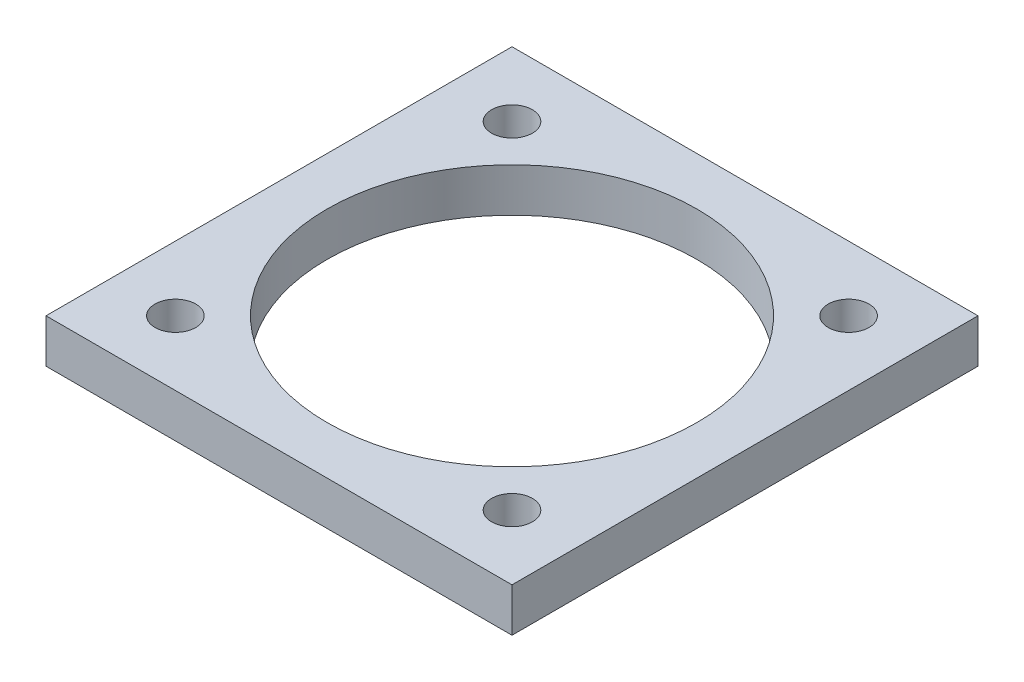
ISO-10303-21;
HEADER;
FILE_DESCRIPTION(('STEP AP214'),'2;1');
FILE_NAME('part.step','',(''),(''),'','','');
FILE_SCHEMA(('AUTOMOTIVE_DESIGN { 1 0 10303 214 1 1 1 1 }'));
ENDSEC;
DATA;
#1=APPLICATION_CONTEXT('core data for automotive mechanical design processes');
#2=APPLICATION_PROTOCOL_DEFINITION('international standard','automotive_design',2000,#1);
#3=PRODUCT_CONTEXT('',#1,'mechanical');
#4=PRODUCT('Part','Part','',(#3));
#5=PRODUCT_RELATED_PRODUCT_CATEGORY('part','',(#4));
#6=PRODUCT_DEFINITION_FORMATION('','',#4);
#7=PRODUCT_DEFINITION_CONTEXT('part definition',#1,'design');
#8=PRODUCT_DEFINITION('design','',#6,#7);
#9=PRODUCT_DEFINITION_SHAPE('','',#8);
#10=(LENGTH_UNIT() NAMED_UNIT(*) SI_UNIT(.MILLI.,.METRE.));
#11=(NAMED_UNIT(*) PLANE_ANGLE_UNIT() SI_UNIT($,.RADIAN.));
#12=(NAMED_UNIT(*) SI_UNIT($,.STERADIAN.) SOLID_ANGLE_UNIT());
#13=UNCERTAINTY_MEASURE_WITH_UNIT(LENGTH_MEASURE(1.E-05),#10,'distance_accuracy_value','');
#14=(GEOMETRIC_REPRESENTATION_CONTEXT(3) GLOBAL_UNCERTAINTY_ASSIGNED_CONTEXT((#13)) GLOBAL_UNIT_ASSIGNED_CONTEXT((#10,
#11,#12)) REPRESENTATION_CONTEXT('',''));
#15=CARTESIAN_POINT('',(0.,0.,0.));
#16=DIRECTION('',(0.,0.,1.));
#17=DIRECTION('',(1.,0.,0.));
#18=AXIS2_PLACEMENT_3D('',#15,#16,#17);
#19=CARTESIAN_POINT('',(0.,3.,0.));
#20=DIRECTION('',(0.,1.,0.));
#21=DIRECTION('',(0.,0.,1.));
#22=AXIS2_PLACEMENT_3D('',#19,#20,#21);
#23=PLANE('',#22);
#24=CARTESIAN_POINT('',(-11.557,3.,-11.557));
#25=DIRECTION('',(0.,1.,0.));
#26=DIRECTION('',(0.,0.,1.));
#27=AXIS2_PLACEMENT_3D('',#24,#25,#26);
#28=CIRCLE('',#27,1.4);
#29=CARTESIAN_POINT('',(-11.557,3.,-10.157));
#30=VERTEX_POINT('',#29);
#31=EDGE_CURVE('E156',#30,#30,#28,.T.);
#32=ORIENTED_EDGE('',*,*,#31,.F.);
#33=EDGE_LOOP('',(#32));
#34=FACE_BOUND('',#33,.T.);
#35=CARTESIAN_POINT('',(11.557,3.,11.557));
#36=DIRECTION('',(0.,1.,0.));
#37=DIRECTION('',(0.,0.,1.));
#38=AXIS2_PLACEMENT_3D('',#35,#36,#37);
#39=CIRCLE('',#38,1.4);
#40=CARTESIAN_POINT('',(11.557,3.,12.957));
#41=VERTEX_POINT('',#40);
#42=EDGE_CURVE('E140',#41,#41,#39,.T.);
#43=ORIENTED_EDGE('',*,*,#42,.F.);
#44=EDGE_LOOP('',(#43));
#45=FACE_BOUND('',#44,.T.);
#46=DIRECTION('',(0.,0.,1.));
#47=VECTOR('',#46,1.);
#48=CARTESIAN_POINT('',(-16.,3.,16.));
#49=LINE('',#48,#47);
#50=CARTESIAN_POINT('',(-16.,3.,-16.));
#51=VERTEX_POINT('',#50);
#52=CARTESIAN_POINT('',(-16.,3.,16.));
#53=VERTEX_POINT('',#52);
#54=EDGE_CURVE('E98',#51,#53,#49,.T.);
#55=ORIENTED_EDGE('',*,*,#54,.T.);
#56=DIRECTION('',(1.,0.,0.));
#57=VECTOR('',#56,1.);
#58=CARTESIAN_POINT('',(16.,3.,16.));
#59=LINE('',#58,#57);
#60=CARTESIAN_POINT('',(16.,3.,16.));
#61=VERTEX_POINT('',#60);
#62=EDGE_CURVE('E93',#53,#61,#59,.T.);
#63=ORIENTED_EDGE('',*,*,#62,.T.);
#64=DIRECTION('',(0.,0.,-1.));
#65=VECTOR('',#64,1.);
#66=CARTESIAN_POINT('',(16.,3.,16.));
#67=LINE('',#66,#65);
#68=CARTESIAN_POINT('',(16.,3.,-16.));
#69=VERTEX_POINT('',#68);
#70=EDGE_CURVE('E96',#61,#69,#67,.T.);
#71=ORIENTED_EDGE('',*,*,#70,.T.);
#72=DIRECTION('',(-1.,0.,0.));
#73=VECTOR('',#72,1.);
#74=CARTESIAN_POINT('',(16.,3.,-16.));
#75=LINE('',#74,#73);
#76=EDGE_CURVE('E63',#69,#51,#75,.T.);
#77=ORIENTED_EDGE('',*,*,#76,.T.);
#78=EDGE_LOOP('',(#55,#63,#71,#77));
#79=FACE_BOUND('',#78,.T.);
#80=CARTESIAN_POINT('',(-11.557,3.,11.557));
#81=DIRECTION('',(0.,1.,0.));
#82=DIRECTION('',(0.,0.,1.));
#83=AXIS2_PLACEMENT_3D('',#80,#81,#82);
#84=CIRCLE('',#83,1.4);
#85=CARTESIAN_POINT('',(-11.557,3.,12.957));
#86=VERTEX_POINT('',#85);
#87=EDGE_CURVE('E118',#86,#86,#84,.T.);
#88=ORIENTED_EDGE('',*,*,#87,.F.);
#89=EDGE_LOOP('',(#88));
#90=FACE_BOUND('',#89,.T.);
#91=CARTESIAN_POINT('',(11.557,3.,-11.557));
#92=DIRECTION('',(0.,1.,0.));
#93=DIRECTION('',(0.,0.,1.));
#94=AXIS2_PLACEMENT_3D('',#91,#92,#93);
#95=CIRCLE('',#94,1.4);
#96=CARTESIAN_POINT('',(11.557,3.,-10.157));
#97=VERTEX_POINT('',#96);
#98=EDGE_CURVE('E148',#97,#97,#95,.T.);
#99=ORIENTED_EDGE('',*,*,#98,.F.);
#100=EDGE_LOOP('',(#99));
#101=FACE_BOUND('',#100,.T.);
#102=CARTESIAN_POINT('',(0.,3.,0.));
#103=DIRECTION('',(0.,1.,0.));
#104=DIRECTION('',(0.,0.,1.));
#105=AXIS2_PLACEMENT_3D('',#102,#103,#104);
#106=CIRCLE('',#105,12.7);
#107=CARTESIAN_POINT('',(0.,3.,12.7));
#108=VERTEX_POINT('',#107);
#109=EDGE_CURVE('E164',#108,#108,#106,.T.);
#110=ORIENTED_EDGE('',*,*,#109,.F.);
#111=EDGE_LOOP('',(#110));
#112=FACE_BOUND('',#111,.T.);
#113=ADVANCED_FACE('F45',(#34,#45,#79,#90,#101,#112),#23,.T.);
#114=CARTESIAN_POINT('',(0.,0.,0.));
#115=DIRECTION('',(0.,1.,0.));
#116=DIRECTION('',(0.,0.,1.));
#117=AXIS2_PLACEMENT_3D('',#114,#115,#116);
#118=PLANE('',#117);
#119=DIRECTION('',(0.,0.,1.));
#120=VECTOR('',#119,1.);
#121=CARTESIAN_POINT('',(-16.,0.,16.));
#122=LINE('',#121,#120);
#123=CARTESIAN_POINT('',(-16.,0.,-16.));
#124=VERTEX_POINT('',#123);
#125=CARTESIAN_POINT('',(-16.,0.,16.));
#126=VERTEX_POINT('',#125);
#127=EDGE_CURVE('E114',#124,#126,#122,.T.);
#128=ORIENTED_EDGE('',*,*,#127,.F.);
#129=DIRECTION('',(-1.,0.,0.));
#130=VECTOR('',#129,1.);
#131=CARTESIAN_POINT('',(16.,0.,-16.));
#132=LINE('',#131,#130);
#133=CARTESIAN_POINT('',(16.,0.,-16.));
#134=VERTEX_POINT('',#133);
#135=EDGE_CURVE('E86',#134,#124,#132,.T.);
#136=ORIENTED_EDGE('',*,*,#135,.F.);
#137=DIRECTION('',(0.,0.,-1.));
#138=VECTOR('',#137,1.);
#139=CARTESIAN_POINT('',(16.,0.,16.));
#140=LINE('',#139,#138);
#141=CARTESIAN_POINT('',(16.,0.,16.));
#142=VERTEX_POINT('',#141);
#143=EDGE_CURVE('E80',#142,#134,#140,.T.);
#144=ORIENTED_EDGE('',*,*,#143,.F.);
#145=DIRECTION('',(1.,0.,0.));
#146=VECTOR('',#145,1.);
#147=CARTESIAN_POINT('',(16.,0.,16.));
#148=LINE('',#147,#146);
#149=EDGE_CURVE('E103',#126,#142,#148,.T.);
#150=ORIENTED_EDGE('',*,*,#149,.F.);
#151=EDGE_LOOP('',(#128,#136,#144,#150));
#152=FACE_BOUND('',#151,.T.);
#153=CARTESIAN_POINT('',(-11.557,0.,11.557));
#154=DIRECTION('',(0.,1.,0.));
#155=DIRECTION('',(0.,0.,1.));
#156=AXIS2_PLACEMENT_3D('',#153,#154,#155);
#157=CIRCLE('',#156,1.4);
#158=CARTESIAN_POINT('',(-11.557,0.,12.957));
#159=VERTEX_POINT('',#158);
#160=EDGE_CURVE('E136',#159,#159,#157,.T.);
#161=ORIENTED_EDGE('',*,*,#160,.T.);
#162=EDGE_LOOP('',(#161));
#163=FACE_BOUND('',#162,.T.);
#164=CARTESIAN_POINT('',(11.557,0.,11.557));
#165=DIRECTION('',(0.,1.,0.));
#166=DIRECTION('',(0.,0.,1.));
#167=AXIS2_PLACEMENT_3D('',#164,#165,#166);
#168=CIRCLE('',#167,1.4);
#169=CARTESIAN_POINT('',(11.557,0.,12.957));
#170=VERTEX_POINT('',#169);
#171=EDGE_CURVE('E144',#170,#170,#168,.T.);
#172=ORIENTED_EDGE('',*,*,#171,.T.);
#173=EDGE_LOOP('',(#172));
#174=FACE_BOUND('',#173,.T.);
#175=CARTESIAN_POINT('',(11.557,0.,-11.557));
#176=DIRECTION('',(0.,1.,0.));
#177=DIRECTION('',(0.,0.,1.));
#178=AXIS2_PLACEMENT_3D('',#175,#176,#177);
#179=CIRCLE('',#178,1.4);
#180=CARTESIAN_POINT('',(11.557,0.,-10.157));
#181=VERTEX_POINT('',#180);
#182=EDGE_CURVE('E152',#181,#181,#179,.T.);
#183=ORIENTED_EDGE('',*,*,#182,.T.);
#184=EDGE_LOOP('',(#183));
#185=FACE_BOUND('',#184,.T.);
#186=CARTESIAN_POINT('',(-11.557,0.,-11.557));
#187=DIRECTION('',(0.,1.,0.));
#188=DIRECTION('',(0.,0.,1.));
#189=AXIS2_PLACEMENT_3D('',#186,#187,#188);
#190=CIRCLE('',#189,1.4);
#191=CARTESIAN_POINT('',(-11.557,0.,-10.157));
#192=VERTEX_POINT('',#191);
#193=EDGE_CURVE('E160',#192,#192,#190,.T.);
#194=ORIENTED_EDGE('',*,*,#193,.T.);
#195=EDGE_LOOP('',(#194));
#196=FACE_BOUND('',#195,.T.);
#197=CARTESIAN_POINT('',(0.,0.,0.));
#198=DIRECTION('',(0.,1.,0.));
#199=DIRECTION('',(0.,0.,1.));
#200=AXIS2_PLACEMENT_3D('',#197,#198,#199);
#201=CIRCLE('',#200,12.7);
#202=CARTESIAN_POINT('',(0.,0.,12.7));
#203=VERTEX_POINT('',#202);
#204=EDGE_CURVE('E168',#203,#203,#201,.T.);
#205=ORIENTED_EDGE('',*,*,#204,.T.);
#206=EDGE_LOOP('',(#205));
#207=FACE_BOUND('',#206,.T.);
#208=ADVANCED_FACE('F131',(#152,#163,#174,#185,#196,#207),#118,.F.);
#209=CARTESIAN_POINT('',(-16.,3.,16.));
#210=DIRECTION('',(1.,0.,0.));
#211=DIRECTION('',(0.,0.,-1.));
#212=AXIS2_PLACEMENT_3D('',#209,#210,#211);
#213=PLANE('',#212);
#214=ORIENTED_EDGE('',*,*,#127,.T.);
#215=DIRECTION('',(0.,-1.,0.));
#216=VECTOR('',#215,1.);
#217=CARTESIAN_POINT('',(-16.,3.,16.));
#218=LINE('',#217,#216);
#219=EDGE_CURVE('E11',#53,#126,#218,.T.);
#220=ORIENTED_EDGE('',*,*,#219,.F.);
#221=ORIENTED_EDGE('',*,*,#54,.F.);
#222=DIRECTION('',(0.,-1.,0.));
#223=VECTOR('',#222,1.);
#224=CARTESIAN_POINT('',(-16.,3.,-16.));
#225=LINE('',#224,#223);
#226=EDGE_CURVE('E110',#51,#124,#225,.T.);
#227=ORIENTED_EDGE('',*,*,#226,.T.);
#228=EDGE_LOOP('',(#214,#220,#221,#227));
#229=FACE_BOUND('',#228,.T.);
#230=ADVANCED_FACE('F47',(#229),#213,.F.);
#231=CARTESIAN_POINT('',(16.,3.,16.));
#232=DIRECTION('',(0.,0.,-1.));
#233=DIRECTION('',(-1.,0.,0.));
#234=AXIS2_PLACEMENT_3D('',#231,#232,#233);
#235=PLANE('',#234);
#236=ORIENTED_EDGE('',*,*,#149,.T.);
#237=DIRECTION('',(0.,-1.,0.));
#238=VECTOR('',#237,1.);
#239=CARTESIAN_POINT('',(16.,3.,16.));
#240=LINE('',#239,#238);
#241=EDGE_CURVE('E55',#61,#142,#240,.T.);
#242=ORIENTED_EDGE('',*,*,#241,.F.);
#243=ORIENTED_EDGE('',*,*,#62,.F.);
#244=ORIENTED_EDGE('',*,*,#219,.T.);
#245=EDGE_LOOP('',(#236,#242,#243,#244));
#246=FACE_BOUND('',#245,.T.);
#247=ADVANCED_FACE('F102',(#246),#235,.F.);
#248=CARTESIAN_POINT('',(16.,3.,16.));
#249=DIRECTION('',(-1.,0.,0.));
#250=DIRECTION('',(0.,0.,1.));
#251=AXIS2_PLACEMENT_3D('',#248,#249,#250);
#252=PLANE('',#251);
#253=ORIENTED_EDGE('',*,*,#143,.T.);
#254=DIRECTION('',(0.,-1.,0.));
#255=VECTOR('',#254,1.);
#256=CARTESIAN_POINT('',(16.,3.,-16.));
#257=LINE('',#256,#255);
#258=EDGE_CURVE('E105',#69,#134,#257,.T.);
#259=ORIENTED_EDGE('',*,*,#258,.F.);
#260=ORIENTED_EDGE('',*,*,#70,.F.);
#261=ORIENTED_EDGE('',*,*,#241,.T.);
#262=EDGE_LOOP('',(#253,#259,#260,#261));
#263=FACE_BOUND('',#262,.T.);
#264=ADVANCED_FACE('F106',(#263),#252,.F.);
#265=CARTESIAN_POINT('',(16.,3.,-16.));
#266=DIRECTION('',(0.,0.,1.));
#267=DIRECTION('',(1.,0.,0.));
#268=AXIS2_PLACEMENT_3D('',#265,#266,#267);
#269=PLANE('',#268);
#270=ORIENTED_EDGE('',*,*,#135,.T.);
#271=ORIENTED_EDGE('',*,*,#226,.F.);
#272=ORIENTED_EDGE('',*,*,#76,.F.);
#273=ORIENTED_EDGE('',*,*,#258,.T.);
#274=EDGE_LOOP('',(#270,#271,#272,#273));
#275=FACE_BOUND('',#274,.T.);
#276=ADVANCED_FACE('F128',(#275),#269,.F.);
#277=CARTESIAN_POINT('',(-11.557,3.,11.557));
#278=DIRECTION('',(0.,-1.,0.));
#279=DIRECTION('',(0.,0.,-1.));
#280=AXIS2_PLACEMENT_3D('',#277,#278,#279);
#281=CYLINDRICAL_SURFACE('',#280,1.4);
#282=ORIENTED_EDGE('',*,*,#87,.T.);
#283=EDGE_LOOP('',(#282));
#284=FACE_BOUND('',#283,.T.);
#285=ORIENTED_EDGE('',*,*,#160,.F.);
#286=EDGE_LOOP('',(#285));
#287=FACE_BOUND('',#286,.T.);
#288=ADVANCED_FACE('F189',(#284,#287),#281,.F.);
#289=CARTESIAN_POINT('',(11.557,3.,11.557));
#290=DIRECTION('',(0.,-1.,0.));
#291=DIRECTION('',(0.,0.,-1.));
#292=AXIS2_PLACEMENT_3D('',#289,#290,#291);
#293=CYLINDRICAL_SURFACE('',#292,1.4);
#294=ORIENTED_EDGE('',*,*,#42,.T.);
#295=EDGE_LOOP('',(#294));
#296=FACE_BOUND('',#295,.T.);
#297=ORIENTED_EDGE('',*,*,#171,.F.);
#298=EDGE_LOOP('',(#297));
#299=FACE_BOUND('',#298,.T.);
#300=ADVANCED_FACE('F234',(#296,#299),#293,.F.);
#301=CARTESIAN_POINT('',(11.557,3.,-11.557));
#302=DIRECTION('',(0.,-1.,0.));
#303=DIRECTION('',(0.,0.,-1.));
#304=AXIS2_PLACEMENT_3D('',#301,#302,#303);
#305=CYLINDRICAL_SURFACE('',#304,1.4);
#306=ORIENTED_EDGE('',*,*,#98,.T.);
#307=EDGE_LOOP('',(#306));
#308=FACE_BOUND('',#307,.T.);
#309=ORIENTED_EDGE('',*,*,#182,.F.);
#310=EDGE_LOOP('',(#309));
#311=FACE_BOUND('',#310,.T.);
#312=ADVANCED_FACE('F242',(#308,#311),#305,.F.);
#313=CARTESIAN_POINT('',(-11.557,3.,-11.557));
#314=DIRECTION('',(0.,-1.,0.));
#315=DIRECTION('',(0.,0.,-1.));
#316=AXIS2_PLACEMENT_3D('',#313,#314,#315);
#317=CYLINDRICAL_SURFACE('',#316,1.4);
#318=ORIENTED_EDGE('',*,*,#31,.T.);
#319=EDGE_LOOP('',(#318));
#320=FACE_BOUND('',#319,.T.);
#321=ORIENTED_EDGE('',*,*,#193,.F.);
#322=EDGE_LOOP('',(#321));
#323=FACE_BOUND('',#322,.T.);
#324=ADVANCED_FACE('F250',(#320,#323),#317,.F.);
#325=CARTESIAN_POINT('',(0.,3.,0.));
#326=DIRECTION('',(0.,-1.,0.));
#327=DIRECTION('',(0.,0.,-1.));
#328=AXIS2_PLACEMENT_3D('',#325,#326,#327);
#329=CYLINDRICAL_SURFACE('',#328,12.7);
#330=ORIENTED_EDGE('',*,*,#109,.T.);
#331=EDGE_LOOP('',(#330));
#332=FACE_BOUND('',#331,.T.);
#333=ORIENTED_EDGE('',*,*,#204,.F.);
#334=EDGE_LOOP('',(#333));
#335=FACE_BOUND('',#334,.T.);
#336=ADVANCED_FACE('F176',(#332,#335),#329,.F.);
#337=CLOSED_SHELL('',(#113,#208,#230,#247,#264,#276,#288,#300,#312,#324,#336));
#338=MANIFOLD_SOLID_BREP('B2',#337);
#339=ADVANCED_BREP_SHAPE_REPRESENTATION('',(#18,#338),#14);
#340=SHAPE_DEFINITION_REPRESENTATION(#9,#339);
ENDSEC;
END-ISO-10303-21;
